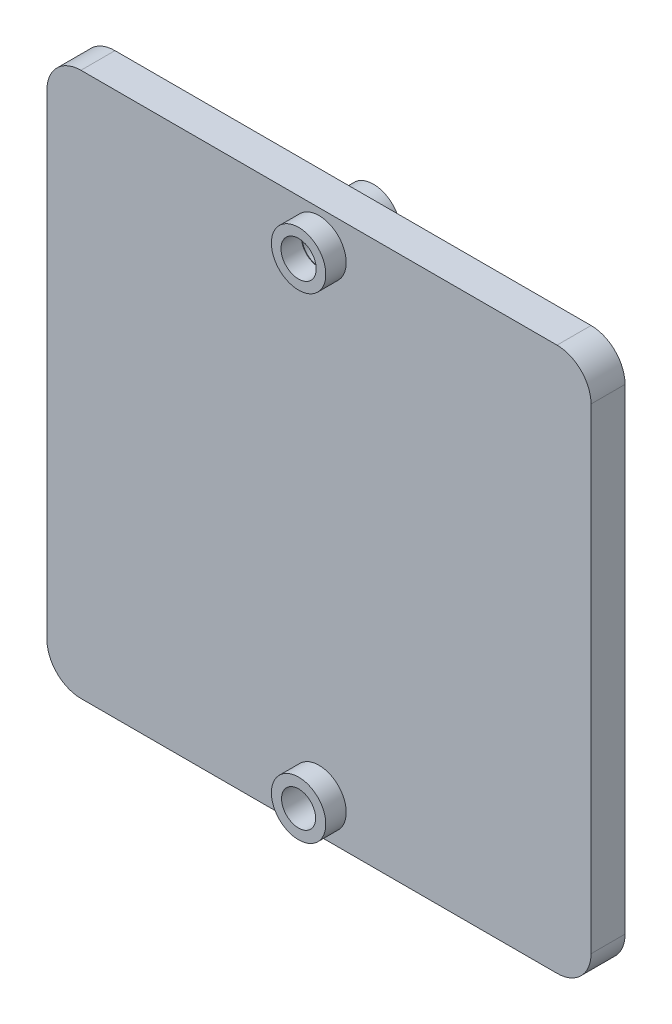
ISO-10303-21;
HEADER;
FILE_DESCRIPTION(('STEP AP214'),'2;1');
FILE_NAME('part.step','',(''),(''),'','','');
FILE_SCHEMA(('AUTOMOTIVE_DESIGN { 1 0 10303 214 1 1 1 1 }'));
ENDSEC;
DATA;
#1=APPLICATION_CONTEXT('core data for automotive mechanical design processes');
#2=APPLICATION_PROTOCOL_DEFINITION('international standard','automotive_design',2000,#1);
#3=PRODUCT_CONTEXT('',#1,'mechanical');
#4=PRODUCT('Part','Part','',(#3));
#5=PRODUCT_RELATED_PRODUCT_CATEGORY('part','',(#4));
#6=PRODUCT_DEFINITION_FORMATION('','',#4);
#7=PRODUCT_DEFINITION_CONTEXT('part definition',#1,'design');
#8=PRODUCT_DEFINITION('design','',#6,#7);
#9=PRODUCT_DEFINITION_SHAPE('','',#8);
#10=(LENGTH_UNIT() NAMED_UNIT(*) SI_UNIT(.MILLI.,.METRE.));
#11=(NAMED_UNIT(*) PLANE_ANGLE_UNIT() SI_UNIT($,.RADIAN.));
#12=(NAMED_UNIT(*) SI_UNIT($,.STERADIAN.) SOLID_ANGLE_UNIT());
#13=UNCERTAINTY_MEASURE_WITH_UNIT(LENGTH_MEASURE(1.E-05),#10,'distance_accuracy_value','');
#14=(GEOMETRIC_REPRESENTATION_CONTEXT(3) GLOBAL_UNCERTAINTY_ASSIGNED_CONTEXT((#13)) GLOBAL_UNIT_ASSIGNED_CONTEXT((#10,
#11,#12)) REPRESENTATION_CONTEXT('',''));
#15=CARTESIAN_POINT('',(0.,0.,0.));
#16=DIRECTION('',(0.,0.,1.));
#17=DIRECTION('',(1.,0.,0.));
#18=AXIS2_PLACEMENT_3D('',#15,#16,#17);
#19=CARTESIAN_POINT('',(0.,0.,25.));
#20=DIRECTION('',(1.,0.,0.));
#21=DIRECTION('',(0.,1.,0.));
#22=AXIS2_PLACEMENT_3D('',#19,#20,#21);
#23=PLANE('',#22);
#24=DIRECTION('',(0.,-1.,0.));
#25=VECTOR('',#24,1.);
#26=CARTESIAN_POINT('',(0.,0.,0.));
#27=LINE('',#26,#25);
#28=CARTESIAN_POINT('',(0.,-25.,0.));
#29=VERTEX_POINT('',#28);
#30=CARTESIAN_POINT('',(0.,-375.,0.));
#31=VERTEX_POINT('',#30);
#32=EDGE_CURVE('E129',#29,#31,#27,.T.);
#33=ORIENTED_EDGE('',*,*,#32,.T.);
#34=DIRECTION('',(0.,0.,-1.));
#35=VECTOR('',#34,1.);
#36=CARTESIAN_POINT('',(0.,-375.,25.));
#37=LINE('',#36,#35);
#38=CARTESIAN_POINT('',(0.,-375.,25.));
#39=VERTEX_POINT('',#38);
#40=EDGE_CURVE('E107',#31,#39,#37,.F.);
#41=ORIENTED_EDGE('',*,*,#40,.T.);
#42=DIRECTION('',(0.,-1.,0.));
#43=VECTOR('',#42,1.);
#44=CARTESIAN_POINT('',(0.,0.,25.));
#45=LINE('',#44,#43);
#46=CARTESIAN_POINT('',(0.,-25.,25.));
#47=VERTEX_POINT('',#46);
#48=EDGE_CURVE('E139',#47,#39,#45,.T.);
#49=ORIENTED_EDGE('',*,*,#48,.F.);
#50=DIRECTION('',(0.,0.,-1.));
#51=VECTOR('',#50,1.);
#52=CARTESIAN_POINT('',(0.,-25.,25.));
#53=LINE('',#52,#51);
#54=EDGE_CURVE('E112',#47,#29,#53,.T.);
#55=ORIENTED_EDGE('',*,*,#54,.T.);
#56=EDGE_LOOP('',(#33,#41,#49,#55));
#57=FACE_BOUND('',#56,.T.);
#58=ADVANCED_FACE('F33',(#57),#23,.F.);
#59=CARTESIAN_POINT('',(0.,-400.,25.));
#60=DIRECTION('',(0.,1.,0.));
#61=DIRECTION('',(0.,0.,1.));
#62=AXIS2_PLACEMENT_3D('',#59,#60,#61);
#63=PLANE('',#62);
#64=DIRECTION('',(1.,0.,0.));
#65=VECTOR('',#64,1.);
#66=CARTESIAN_POINT('',(0.,-400.,25.));
#67=LINE('',#66,#65);
#68=CARTESIAN_POINT('',(25.,-400.,25.));
#69=VERTEX_POINT('',#68);
#70=CARTESIAN_POINT('',(375.,-400.,25.));
#71=VERTEX_POINT('',#70);
#72=EDGE_CURVE('E122',#69,#71,#67,.T.);
#73=ORIENTED_EDGE('',*,*,#72,.F.);
#74=DIRECTION('',(0.,0.,-1.));
#75=VECTOR('',#74,1.);
#76=CARTESIAN_POINT('',(25.,-400.,25.));
#77=LINE('',#76,#75);
#78=CARTESIAN_POINT('',(25.,-400.,0.));
#79=VERTEX_POINT('',#78);
#80=EDGE_CURVE('E106',#69,#79,#77,.T.);
#81=ORIENTED_EDGE('',*,*,#80,.T.);
#82=DIRECTION('',(1.,0.,0.));
#83=VECTOR('',#82,1.);
#84=CARTESIAN_POINT('',(0.,-400.,0.));
#85=LINE('',#84,#83);
#86=CARTESIAN_POINT('',(375.,-400.,0.));
#87=VERTEX_POINT('',#86);
#88=EDGE_CURVE('E119',#79,#87,#85,.T.);
#89=ORIENTED_EDGE('',*,*,#88,.T.);
#90=DIRECTION('',(0.,0.,-1.));
#91=VECTOR('',#90,1.);
#92=CARTESIAN_POINT('',(375.,-400.,25.));
#93=LINE('',#92,#91);
#94=EDGE_CURVE('E124',#87,#71,#93,.F.);
#95=ORIENTED_EDGE('',*,*,#94,.T.);
#96=EDGE_LOOP('',(#73,#81,#89,#95));
#97=FACE_BOUND('',#96,.T.);
#98=ADVANCED_FACE('F118',(#97),#63,.F.);
#99=CARTESIAN_POINT('',(400.,0.,25.));
#100=DIRECTION('',(-1.,0.,0.));
#101=DIRECTION('',(0.,0.,1.));
#102=AXIS2_PLACEMENT_3D('',#99,#100,#101);
#103=PLANE('',#102);
#104=DIRECTION('',(0.,1.,0.));
#105=VECTOR('',#104,1.);
#106=CARTESIAN_POINT('',(400.,0.,25.));
#107=LINE('',#106,#105);
#108=CARTESIAN_POINT('',(400.,-375.,25.));
#109=VERTEX_POINT('',#108);
#110=CARTESIAN_POINT('',(400.,-25.,25.));
#111=VERTEX_POINT('',#110);
#112=EDGE_CURVE('E192',#109,#111,#107,.T.);
#113=ORIENTED_EDGE('',*,*,#112,.F.);
#114=DIRECTION('',(0.,0.,-1.));
#115=VECTOR('',#114,1.);
#116=CARTESIAN_POINT('',(400.,-375.,25.));
#117=LINE('',#116,#115);
#118=CARTESIAN_POINT('',(400.,-375.,0.));
#119=VERTEX_POINT('',#118);
#120=EDGE_CURVE('E158',#109,#119,#117,.T.);
#121=ORIENTED_EDGE('',*,*,#120,.T.);
#122=DIRECTION('',(0.,1.,0.));
#123=VECTOR('',#122,1.);
#124=CARTESIAN_POINT('',(400.,0.,0.));
#125=LINE('',#124,#123);
#126=CARTESIAN_POINT('',(400.,-25.,0.));
#127=VERTEX_POINT('',#126);
#128=EDGE_CURVE('E128',#119,#127,#125,.T.);
#129=ORIENTED_EDGE('',*,*,#128,.T.);
#130=DIRECTION('',(0.,0.,-1.));
#131=VECTOR('',#130,1.);
#132=CARTESIAN_POINT('',(400.,-25.,25.));
#133=LINE('',#132,#131);
#134=EDGE_CURVE('E156',#127,#111,#133,.F.);
#135=ORIENTED_EDGE('',*,*,#134,.T.);
#136=EDGE_LOOP('',(#113,#121,#129,#135));
#137=FACE_BOUND('',#136,.T.);
#138=ADVANCED_FACE('F207',(#137),#103,.F.);
#139=CARTESIAN_POINT('',(0.,0.,25.));
#140=DIRECTION('',(0.,-1.,0.));
#141=DIRECTION('',(0.,0.,-1.));
#142=AXIS2_PLACEMENT_3D('',#139,#140,#141);
#143=PLANE('',#142);
#144=DIRECTION('',(-1.,0.,0.));
#145=VECTOR('',#144,1.);
#146=CARTESIAN_POINT('',(0.,0.,25.));
#147=LINE('',#146,#145);
#148=CARTESIAN_POINT('',(375.,0.,25.));
#149=VERTEX_POINT('',#148);
#150=CARTESIAN_POINT('',(25.,0.,25.));
#151=VERTEX_POINT('',#150);
#152=EDGE_CURVE('E140',#149,#151,#147,.T.);
#153=ORIENTED_EDGE('',*,*,#152,.F.);
#154=DIRECTION('',(0.,0.,-1.));
#155=VECTOR('',#154,1.);
#156=CARTESIAN_POINT('',(375.,0.,25.));
#157=LINE('',#156,#155);
#158=CARTESIAN_POINT('',(375.,0.,0.));
#159=VERTEX_POINT('',#158);
#160=EDGE_CURVE('E162',#149,#159,#157,.T.);
#161=ORIENTED_EDGE('',*,*,#160,.T.);
#162=DIRECTION('',(-1.,0.,0.));
#163=VECTOR('',#162,1.);
#164=CARTESIAN_POINT('',(0.,0.,0.));
#165=LINE('',#164,#163);
#166=CARTESIAN_POINT('',(25.,0.,0.));
#167=VERTEX_POINT('',#166);
#168=EDGE_CURVE('E132',#159,#167,#165,.T.);
#169=ORIENTED_EDGE('',*,*,#168,.T.);
#170=DIRECTION('',(0.,0.,-1.));
#171=VECTOR('',#170,1.);
#172=CARTESIAN_POINT('',(25.,0.,25.));
#173=LINE('',#172,#171);
#174=EDGE_CURVE('E50',#167,#151,#173,.F.);
#175=ORIENTED_EDGE('',*,*,#174,.T.);
#176=EDGE_LOOP('',(#153,#161,#169,#175));
#177=FACE_BOUND('',#176,.T.);
#178=ADVANCED_FACE('F201',(#177),#143,.F.);
#179=CARTESIAN_POINT('',(0.,0.,25.));
#180=DIRECTION('',(0.,0.,1.));
#181=DIRECTION('',(1.,0.,0.));
#182=AXIS2_PLACEMENT_3D('',#179,#180,#181);
#183=PLANE('',#182);
#184=CARTESIAN_POINT('',(200.,-375.,25.));
#185=DIRECTION('',(0.,0.,1.));
#186=DIRECTION('',(1.,0.,0.));
#187=AXIS2_PLACEMENT_3D('',#184,#185,#186);
#188=CIRCLE('',#187,20.);
#189=CARTESIAN_POINT('',(220.,-375.,25.));
#190=VERTEX_POINT('',#189);
#191=EDGE_CURVE('E11',#190,#190,#188,.T.);
#192=ORIENTED_EDGE('',*,*,#191,.F.);
#193=EDGE_LOOP('',(#192));
#194=FACE_BOUND('',#193,.T.);
#195=CARTESIAN_POINT('',(200.,-25.,25.));
#196=DIRECTION('',(0.,0.,1.));
#197=DIRECTION('',(1.,0.,0.));
#198=AXIS2_PLACEMENT_3D('',#195,#196,#197);
#199=CIRCLE('',#198,20.);
#200=CARTESIAN_POINT('',(220.,-25.,25.));
#201=VERTEX_POINT('',#200);
#202=EDGE_CURVE('E42',#201,#201,#199,.T.);
#203=ORIENTED_EDGE('',*,*,#202,.F.);
#204=EDGE_LOOP('',(#203));
#205=FACE_BOUND('',#204,.T.);
#206=ORIENTED_EDGE('',*,*,#48,.T.);
#207=CARTESIAN_POINT('',(25.,-375.,25.));
#208=DIRECTION('',(0.,0.,1.));
#209=DIRECTION('',(1.,0.,0.));
#210=AXIS2_PLACEMENT_3D('',#207,#208,#209);
#211=CIRCLE('',#210,25.);
#212=EDGE_CURVE('E154',#39,#69,#211,.T.);
#213=ORIENTED_EDGE('',*,*,#212,.T.);
#214=ORIENTED_EDGE('',*,*,#72,.T.);
#215=CARTESIAN_POINT('',(375.,-375.,25.));
#216=DIRECTION('',(0.,0.,1.));
#217=DIRECTION('',(1.,0.,0.));
#218=AXIS2_PLACEMENT_3D('',#215,#216,#217);
#219=CIRCLE('',#218,25.);
#220=EDGE_CURVE('E152',#71,#109,#219,.T.);
#221=ORIENTED_EDGE('',*,*,#220,.T.);
#222=ORIENTED_EDGE('',*,*,#112,.T.);
#223=CARTESIAN_POINT('',(375.,-25.,25.));
#224=DIRECTION('',(0.,0.,1.));
#225=DIRECTION('',(1.,0.,0.));
#226=AXIS2_PLACEMENT_3D('',#223,#224,#225);
#227=CIRCLE('',#226,25.);
#228=EDGE_CURVE('E57',#111,#149,#227,.T.);
#229=ORIENTED_EDGE('',*,*,#228,.T.);
#230=ORIENTED_EDGE('',*,*,#152,.T.);
#231=CARTESIAN_POINT('',(25.,-25.,25.));
#232=DIRECTION('',(0.,0.,1.));
#233=DIRECTION('',(1.,0.,0.));
#234=AXIS2_PLACEMENT_3D('',#231,#232,#233);
#235=CIRCLE('',#234,25.);
#236=EDGE_CURVE('E149',#151,#47,#235,.T.);
#237=ORIENTED_EDGE('',*,*,#236,.T.);
#238=EDGE_LOOP('',(#206,#213,#214,#221,#222,#229,#230,#237));
#239=FACE_BOUND('',#238,.T.);
#240=ADVANCED_FACE('F194',(#194,#205,#239),#183,.T.);
#241=CARTESIAN_POINT('',(0.,0.,0.));
#242=DIRECTION('',(0.,0.,1.));
#243=DIRECTION('',(1.,0.,0.));
#244=AXIS2_PLACEMENT_3D('',#241,#242,#243);
#245=PLANE('',#244);
#246=CARTESIAN_POINT('',(200.,-375.,0.));
#247=DIRECTION('',(0.,0.,1.));
#248=DIRECTION('',(1.,0.,0.));
#249=AXIS2_PLACEMENT_3D('',#246,#247,#248);
#250=CIRCLE('',#249,20.);
#251=CARTESIAN_POINT('',(220.,-375.,0.));
#252=VERTEX_POINT('',#251);
#253=EDGE_CURVE('E37',#252,#252,#250,.T.);
#254=ORIENTED_EDGE('',*,*,#253,.T.);
#255=EDGE_LOOP('',(#254));
#256=FACE_BOUND('',#255,.T.);
#257=CARTESIAN_POINT('',(200.,-25.,0.));
#258=DIRECTION('',(0.,0.,1.));
#259=DIRECTION('',(1.,0.,0.));
#260=AXIS2_PLACEMENT_3D('',#257,#258,#259);
#261=CIRCLE('',#260,20.);
#262=CARTESIAN_POINT('',(220.,-25.,0.));
#263=VERTEX_POINT('',#262);
#264=EDGE_CURVE('E167',#263,#263,#261,.T.);
#265=ORIENTED_EDGE('',*,*,#264,.T.);
#266=EDGE_LOOP('',(#265));
#267=FACE_BOUND('',#266,.T.);
#268=ORIENTED_EDGE('',*,*,#88,.F.);
#269=CARTESIAN_POINT('',(25.,-375.,0.));
#270=DIRECTION('',(0.,0.,1.));
#271=DIRECTION('',(1.,0.,0.));
#272=AXIS2_PLACEMENT_3D('',#269,#270,#271);
#273=CIRCLE('',#272,25.);
#274=EDGE_CURVE('E102',#79,#31,#273,.F.);
#275=ORIENTED_EDGE('',*,*,#274,.T.);
#276=ORIENTED_EDGE('',*,*,#32,.F.);
#277=CARTESIAN_POINT('',(25.,-25.,0.));
#278=DIRECTION('',(0.,0.,1.));
#279=DIRECTION('',(1.,0.,0.));
#280=AXIS2_PLACEMENT_3D('',#277,#278,#279);
#281=CIRCLE('',#280,25.);
#282=EDGE_CURVE('E123',#29,#167,#281,.F.);
#283=ORIENTED_EDGE('',*,*,#282,.T.);
#284=ORIENTED_EDGE('',*,*,#168,.F.);
#285=CARTESIAN_POINT('',(375.,-25.,0.));
#286=DIRECTION('',(0.,0.,1.));
#287=DIRECTION('',(1.,0.,0.));
#288=AXIS2_PLACEMENT_3D('',#285,#286,#287);
#289=CIRCLE('',#288,25.);
#290=EDGE_CURVE('E143',#159,#127,#289,.F.);
#291=ORIENTED_EDGE('',*,*,#290,.T.);
#292=ORIENTED_EDGE('',*,*,#128,.F.);
#293=CARTESIAN_POINT('',(375.,-375.,0.));
#294=DIRECTION('',(0.,0.,1.));
#295=DIRECTION('',(1.,0.,0.));
#296=AXIS2_PLACEMENT_3D('',#293,#294,#295);
#297=CIRCLE('',#296,25.);
#298=EDGE_CURVE('E113',#119,#87,#297,.F.);
#299=ORIENTED_EDGE('',*,*,#298,.T.);
#300=EDGE_LOOP('',(#268,#275,#276,#283,#284,#291,#292,#299));
#301=FACE_BOUND('',#300,.T.);
#302=ADVANCED_FACE('F126',(#256,#267,#301),#245,.F.);
#303=CARTESIAN_POINT('',(25.,-375.,25.));
#304=DIRECTION('',(0.,0.,-1.));
#305=DIRECTION('',(-1.,0.,0.));
#306=AXIS2_PLACEMENT_3D('',#303,#304,#305);
#307=CYLINDRICAL_SURFACE('',#306,25.);
#308=ORIENTED_EDGE('',*,*,#212,.F.);
#309=ORIENTED_EDGE('',*,*,#40,.F.);
#310=ORIENTED_EDGE('',*,*,#274,.F.);
#311=ORIENTED_EDGE('',*,*,#80,.F.);
#312=EDGE_LOOP('',(#308,#309,#310,#311));
#313=FACE_BOUND('',#312,.T.);
#314=ADVANCED_FACE('F105',(#313),#307,.T.);
#315=CARTESIAN_POINT('',(375.,-375.,25.));
#316=DIRECTION('',(0.,0.,-1.));
#317=DIRECTION('',(-1.,0.,0.));
#318=AXIS2_PLACEMENT_3D('',#315,#316,#317);
#319=CYLINDRICAL_SURFACE('',#318,25.);
#320=ORIENTED_EDGE('',*,*,#220,.F.);
#321=ORIENTED_EDGE('',*,*,#94,.F.);
#322=ORIENTED_EDGE('',*,*,#298,.F.);
#323=ORIENTED_EDGE('',*,*,#120,.F.);
#324=EDGE_LOOP('',(#320,#321,#322,#323));
#325=FACE_BOUND('',#324,.T.);
#326=ADVANCED_FACE('F211',(#325),#319,.T.);
#327=CARTESIAN_POINT('',(375.,-25.,25.));
#328=DIRECTION('',(0.,0.,-1.));
#329=DIRECTION('',(-1.,0.,0.));
#330=AXIS2_PLACEMENT_3D('',#327,#328,#329);
#331=CYLINDRICAL_SURFACE('',#330,25.);
#332=ORIENTED_EDGE('',*,*,#228,.F.);
#333=ORIENTED_EDGE('',*,*,#134,.F.);
#334=ORIENTED_EDGE('',*,*,#290,.F.);
#335=ORIENTED_EDGE('',*,*,#160,.F.);
#336=EDGE_LOOP('',(#332,#333,#334,#335));
#337=FACE_BOUND('',#336,.T.);
#338=ADVANCED_FACE('F203',(#337),#331,.T.);
#339=CARTESIAN_POINT('',(25.,-25.,25.));
#340=DIRECTION('',(0.,0.,-1.));
#341=DIRECTION('',(-1.,0.,0.));
#342=AXIS2_PLACEMENT_3D('',#339,#340,#341);
#343=CYLINDRICAL_SURFACE('',#342,25.);
#344=ORIENTED_EDGE('',*,*,#236,.F.);
#345=ORIENTED_EDGE('',*,*,#174,.F.);
#346=ORIENTED_EDGE('',*,*,#282,.F.);
#347=ORIENTED_EDGE('',*,*,#54,.F.);
#348=EDGE_LOOP('',(#344,#345,#346,#347));
#349=FACE_BOUND('',#348,.T.);
#350=ADVANCED_FACE('F35',(#349),#343,.T.);
#351=CARTESIAN_POINT('',(200.,-25.,40.));
#352=DIRECTION('',(0.,0.,-1.));
#353=DIRECTION('',(-1.,0.,0.));
#354=AXIS2_PLACEMENT_3D('',#351,#352,#353);
#355=CYLINDRICAL_SURFACE('',#354,20.);
#356=CARTESIAN_POINT('',(200.,-25.,-15.));
#357=DIRECTION('',(0.,0.,-1.));
#358=DIRECTION('',(-1.,0.,0.));
#359=AXIS2_PLACEMENT_3D('',#356,#357,#358);
#360=CIRCLE('',#359,20.);
#361=CARTESIAN_POINT('',(180.,-25.,-15.));
#362=VERTEX_POINT('',#361);
#363=EDGE_CURVE('E299',#362,#362,#360,.T.);
#364=ORIENTED_EDGE('',*,*,#363,.F.);
#365=EDGE_LOOP('',(#364));
#366=FACE_BOUND('',#365,.T.);
#367=ORIENTED_EDGE('',*,*,#264,.F.);
#368=EDGE_LOOP('',(#367));
#369=FACE_BOUND('',#368,.T.);
#370=ADVANCED_FACE('F252',(#366,#369),#355,.T.);
#371=CARTESIAN_POINT('',(200.,-25.,-15.));
#372=DIRECTION('',(0.,0.,-1.));
#373=DIRECTION('',(-1.,0.,0.));
#374=AXIS2_PLACEMENT_3D('',#371,#372,#373);
#375=PLANE('',#374);
#376=ORIENTED_EDGE('',*,*,#363,.T.);
#377=EDGE_LOOP('',(#376));
#378=FACE_BOUND('',#377,.T.);
#379=CARTESIAN_POINT('',(200.,-25.,-15.));
#380=DIRECTION('',(0.,0.,-1.));
#381=DIRECTION('',(-1.,0.,0.));
#382=AXIS2_PLACEMENT_3D('',#379,#380,#381);
#383=CIRCLE('',#382,12.9577398048795);
#384=CARTESIAN_POINT('',(187.04226019512,-25.,-15.));
#385=VERTEX_POINT('',#384);
#386=EDGE_CURVE('E296',#385,#385,#383,.T.);
#387=ORIENTED_EDGE('',*,*,#386,.F.);
#388=EDGE_LOOP('',(#387));
#389=FACE_BOUND('',#388,.T.);
#390=ADVANCED_FACE('F262',(#378,#389),#375,.T.);
#391=CARTESIAN_POINT('',(200.,-25.,40.));
#392=DIRECTION('',(0.,0.,-1.));
#393=DIRECTION('',(-1.,0.,0.));
#394=AXIS2_PLACEMENT_3D('',#391,#392,#393);
#395=CYLINDRICAL_SURFACE('',#394,12.9577398048795);
#396=ORIENTED_EDGE('',*,*,#386,.T.);
#397=EDGE_LOOP('',(#396));
#398=FACE_BOUND('',#397,.T.);
#399=CARTESIAN_POINT('',(200.,-25.,0.));
#400=DIRECTION('',(0.,0.,1.));
#401=DIRECTION('',(1.,0.,0.));
#402=AXIS2_PLACEMENT_3D('',#399,#400,#401);
#403=CIRCLE('',#402,12.9577398048795);
#404=CARTESIAN_POINT('',(212.957739804879,-25.,0.));
#405=VERTEX_POINT('',#404);
#406=EDGE_CURVE('E165',#405,#405,#403,.T.);
#407=ORIENTED_EDGE('',*,*,#406,.T.);
#408=EDGE_LOOP('',(#407));
#409=FACE_BOUND('',#408,.T.);
#410=ADVANCED_FACE('F261',(#398,#409),#395,.F.);
#411=CARTESIAN_POINT('',(200.,-25.,25.));
#412=DIRECTION('',(0.,0.,-1.));
#413=DIRECTION('',(-1.,0.,0.));
#414=AXIS2_PLACEMENT_3D('',#411,#412,#413);
#415=CIRCLE('',#414,12.5);
#416=CARTESIAN_POINT('',(187.5,-25.,25.));
#417=VERTEX_POINT('',#416);
#418=EDGE_CURVE('E134',#417,#417,#415,.T.);
#419=ORIENTED_EDGE('',*,*,#418,.T.);
#420=EDGE_LOOP('',(#419));
#421=FACE_BOUND('',#420,.T.);
#422=CARTESIAN_POINT('',(200.,-25.,25.));
#423=DIRECTION('',(0.,0.,1.));
#424=DIRECTION('',(1.,0.,0.));
#425=AXIS2_PLACEMENT_3D('',#422,#423,#424);
#426=CIRCLE('',#425,12.9577398048795);
#427=CARTESIAN_POINT('',(212.957739804879,-25.,25.));
#428=VERTEX_POINT('',#427);
#429=EDGE_CURVE('E170',#428,#428,#426,.T.);
#430=ORIENTED_EDGE('',*,*,#429,.T.);
#431=EDGE_LOOP('',(#430));
#432=FACE_BOUND('',#431,.T.);
#433=ADVANCED_FACE('F237',(#421,#432),#183,.T.);
#434=CARTESIAN_POINT('',(200.,-25.,25.));
#435=DIRECTION('',(0.,0.,-1.));
#436=DIRECTION('',(-1.,0.,0.));
#437=AXIS2_PLACEMENT_3D('',#434,#435,#436);
#438=CYLINDRICAL_SURFACE('',#437,12.5);
#439=ORIENTED_EDGE('',*,*,#418,.F.);
#440=EDGE_LOOP('',(#439));
#441=FACE_BOUND('',#440,.T.);
#442=CARTESIAN_POINT('',(200.,-25.,0.));
#443=DIRECTION('',(0.,0.,-1.));
#444=DIRECTION('',(-1.,0.,0.));
#445=AXIS2_PLACEMENT_3D('',#442,#443,#444);
#446=CIRCLE('',#445,12.5);
#447=CARTESIAN_POINT('',(187.5,-25.,0.));
#448=VERTEX_POINT('',#447);
#449=EDGE_CURVE('E169',#448,#448,#446,.T.);
#450=ORIENTED_EDGE('',*,*,#449,.T.);
#451=EDGE_LOOP('',(#450));
#452=FACE_BOUND('',#451,.T.);
#453=ADVANCED_FACE('F243',(#441,#452),#438,.F.);
#454=ORIENTED_EDGE('',*,*,#449,.F.);
#455=EDGE_LOOP('',(#454));
#456=FACE_BOUND('',#455,.T.);
#457=ORIENTED_EDGE('',*,*,#406,.F.);
#458=EDGE_LOOP('',(#457));
#459=FACE_BOUND('',#458,.T.);
#460=ADVANCED_FACE('F233',(#456,#459),#245,.F.);
#461=ORIENTED_EDGE('',*,*,#202,.T.);
#462=EDGE_LOOP('',(#461));
#463=FACE_BOUND('',#462,.T.);
#464=CARTESIAN_POINT('',(200.,-25.,40.));
#465=DIRECTION('',(0.,0.,-1.));
#466=DIRECTION('',(-1.,0.,0.));
#467=AXIS2_PLACEMENT_3D('',#464,#465,#466);
#468=CIRCLE('',#467,20.);
#469=CARTESIAN_POINT('',(180.,-25.,40.));
#470=VERTEX_POINT('',#469);
#471=EDGE_CURVE('E176',#470,#470,#468,.T.);
#472=ORIENTED_EDGE('',*,*,#471,.T.);
#473=EDGE_LOOP('',(#472));
#474=FACE_BOUND('',#473,.T.);
#475=ADVANCED_FACE('F247',(#463,#474),#355,.T.);
#476=CARTESIAN_POINT('',(200.,-25.,40.));
#477=DIRECTION('',(0.,0.,-1.));
#478=DIRECTION('',(-1.,0.,0.));
#479=AXIS2_PLACEMENT_3D('',#476,#477,#478);
#480=PLANE('',#479);
#481=CARTESIAN_POINT('',(200.,-25.,40.));
#482=DIRECTION('',(0.,0.,-1.));
#483=DIRECTION('',(-1.,0.,0.));
#484=AXIS2_PLACEMENT_3D('',#481,#482,#483);
#485=CIRCLE('',#484,12.9577398048795);
#486=CARTESIAN_POINT('',(187.04226019512,-25.,40.));
#487=VERTEX_POINT('',#486);
#488=EDGE_CURVE('E181',#487,#487,#485,.T.);
#489=ORIENTED_EDGE('',*,*,#488,.T.);
#490=EDGE_LOOP('',(#489));
#491=FACE_BOUND('',#490,.T.);
#492=ORIENTED_EDGE('',*,*,#471,.F.);
#493=EDGE_LOOP('',(#492));
#494=FACE_BOUND('',#493,.T.);
#495=ADVANCED_FACE('F250',(#491,#494),#480,.F.);
#496=ORIENTED_EDGE('',*,*,#429,.F.);
#497=EDGE_LOOP('',(#496));
#498=FACE_BOUND('',#497,.T.);
#499=ORIENTED_EDGE('',*,*,#488,.F.);
#500=EDGE_LOOP('',(#499));
#501=FACE_BOUND('',#500,.T.);
#502=ADVANCED_FACE('F255',(#498,#501),#395,.F.);
#503=CARTESIAN_POINT('',(200.,-375.,40.));
#504=DIRECTION('',(0.,0.,-1.));
#505=DIRECTION('',(-1.,0.,0.));
#506=AXIS2_PLACEMENT_3D('',#503,#504,#505);
#507=CYLINDRICAL_SURFACE('',#506,20.);
#508=CARTESIAN_POINT('',(200.,-375.,-15.));
#509=DIRECTION('',(0.,0.,-1.));
#510=DIRECTION('',(-1.,0.,0.));
#511=AXIS2_PLACEMENT_3D('',#508,#509,#510);
#512=CIRCLE('',#511,20.);
#513=CARTESIAN_POINT('',(180.,-375.,-15.));
#514=VERTEX_POINT('',#513);
#515=EDGE_CURVE('E283',#514,#514,#512,.T.);
#516=ORIENTED_EDGE('',*,*,#515,.F.);
#517=EDGE_LOOP('',(#516));
#518=FACE_BOUND('',#517,.T.);
#519=ORIENTED_EDGE('',*,*,#253,.F.);
#520=EDGE_LOOP('',(#519));
#521=FACE_BOUND('',#520,.T.);
#522=ADVANCED_FACE('F259',(#518,#521),#507,.T.);
#523=CARTESIAN_POINT('',(200.,-375.,-15.));
#524=DIRECTION('',(0.,0.,-1.));
#525=DIRECTION('',(-1.,0.,0.));
#526=AXIS2_PLACEMENT_3D('',#523,#524,#525);
#527=PLANE('',#526);
#528=ORIENTED_EDGE('',*,*,#515,.T.);
#529=EDGE_LOOP('',(#528));
#530=FACE_BOUND('',#529,.T.);
#531=CARTESIAN_POINT('',(200.,-375.,-15.));
#532=DIRECTION('',(0.,0.,-1.));
#533=DIRECTION('',(-1.,0.,0.));
#534=AXIS2_PLACEMENT_3D('',#531,#532,#533);
#535=CIRCLE('',#534,12.5);
#536=CARTESIAN_POINT('',(187.5,-375.,-15.));
#537=VERTEX_POINT('',#536);
#538=EDGE_CURVE('E286',#537,#537,#535,.T.);
#539=ORIENTED_EDGE('',*,*,#538,.F.);
#540=EDGE_LOOP('',(#539));
#541=FACE_BOUND('',#540,.T.);
#542=ADVANCED_FACE('F269',(#530,#541),#527,.T.);
#543=ORIENTED_EDGE('',*,*,#191,.T.);
#544=EDGE_LOOP('',(#543));
#545=FACE_BOUND('',#544,.T.);
#546=CARTESIAN_POINT('',(200.,-375.,40.));
#547=DIRECTION('',(0.,0.,-1.));
#548=DIRECTION('',(-1.,0.,0.));
#549=AXIS2_PLACEMENT_3D('',#546,#547,#548);
#550=CIRCLE('',#549,20.);
#551=CARTESIAN_POINT('',(180.,-375.,40.));
#552=VERTEX_POINT('',#551);
#553=EDGE_CURVE('E293',#552,#552,#550,.T.);
#554=ORIENTED_EDGE('',*,*,#553,.T.);
#555=EDGE_LOOP('',(#554));
#556=FACE_BOUND('',#555,.T.);
#557=ADVANCED_FACE('F266',(#545,#556),#507,.T.);
#558=CARTESIAN_POINT('',(200.,-375.,40.));
#559=DIRECTION('',(0.,0.,-1.));
#560=DIRECTION('',(-1.,0.,0.));
#561=AXIS2_PLACEMENT_3D('',#558,#559,#560);
#562=PLANE('',#561);
#563=CARTESIAN_POINT('',(200.,-375.,40.));
#564=DIRECTION('',(0.,0.,-1.));
#565=DIRECTION('',(-1.,0.,0.));
#566=AXIS2_PLACEMENT_3D('',#563,#564,#565);
#567=CIRCLE('',#566,12.5);
#568=CARTESIAN_POINT('',(187.5,-375.,40.));
#569=VERTEX_POINT('',#568);
#570=EDGE_CURVE('E288',#569,#569,#567,.T.);
#571=ORIENTED_EDGE('',*,*,#570,.T.);
#572=EDGE_LOOP('',(#571));
#573=FACE_BOUND('',#572,.T.);
#574=ORIENTED_EDGE('',*,*,#553,.F.);
#575=EDGE_LOOP('',(#574));
#576=FACE_BOUND('',#575,.T.);
#577=ADVANCED_FACE('F241',(#573,#576),#562,.F.);
#578=CARTESIAN_POINT('',(200.,-375.,25.));
#579=DIRECTION('',(0.,0.,-1.));
#580=DIRECTION('',(-1.,0.,0.));
#581=AXIS2_PLACEMENT_3D('',#578,#579,#580);
#582=CYLINDRICAL_SURFACE('',#581,12.5);
#583=ORIENTED_EDGE('',*,*,#538,.T.);
#584=EDGE_LOOP('',(#583));
#585=FACE_BOUND('',#584,.T.);
#586=ORIENTED_EDGE('',*,*,#570,.F.);
#587=EDGE_LOOP('',(#586));
#588=FACE_BOUND('',#587,.T.);
#589=ADVANCED_FACE('F238',(#585,#588),#582,.F.);
#590=CLOSED_SHELL('',(#58,#98,#138,#178,#240,#302,#314,#326,#338,#350,#370,#390,#410,#433,#453,
#460,#475,#495,#502,#522,#542,#557,#577,#589));
#591=MANIFOLD_SOLID_BREP('B2',#590);
#592=ADVANCED_BREP_SHAPE_REPRESENTATION('',(#18,#591),#14);
#593=SHAPE_DEFINITION_REPRESENTATION(#9,#592);
ENDSEC;
END-ISO-10303-21;
